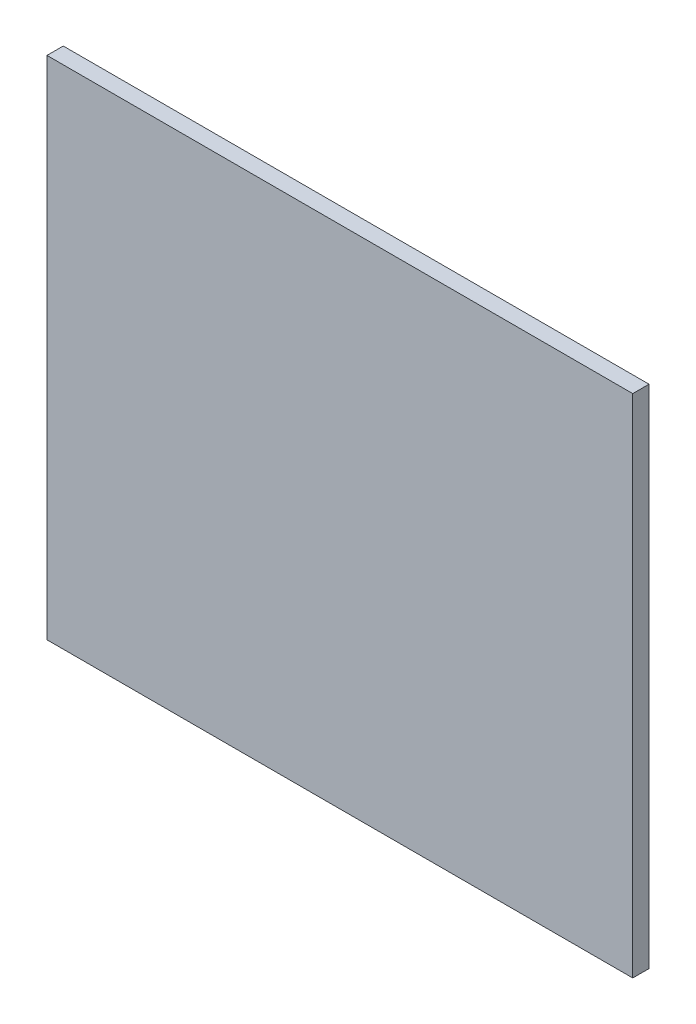
ISO-10303-21;
HEADER;
FILE_DESCRIPTION(('STEP AP214'),'2;1');
FILE_NAME('part.step','',(''),(''),'','','');
FILE_SCHEMA(('AUTOMOTIVE_DESIGN { 1 0 10303 214 1 1 1 1 }'));
ENDSEC;
DATA;
#1=APPLICATION_CONTEXT('core data for automotive mechanical design processes');
#2=APPLICATION_PROTOCOL_DEFINITION('international standard','automotive_design',2000,#1);
#3=PRODUCT_CONTEXT('',#1,'mechanical');
#4=PRODUCT('Part','Part','',(#3));
#5=PRODUCT_RELATED_PRODUCT_CATEGORY('part','',(#4));
#6=PRODUCT_DEFINITION_FORMATION('','',#4);
#7=PRODUCT_DEFINITION_CONTEXT('part definition',#1,'design');
#8=PRODUCT_DEFINITION('design','',#6,#7);
#9=PRODUCT_DEFINITION_SHAPE('','',#8);
#10=(LENGTH_UNIT() NAMED_UNIT(*) SI_UNIT(.MILLI.,.METRE.));
#11=(NAMED_UNIT(*) PLANE_ANGLE_UNIT() SI_UNIT($,.RADIAN.));
#12=(NAMED_UNIT(*) SI_UNIT($,.STERADIAN.) SOLID_ANGLE_UNIT());
#13=UNCERTAINTY_MEASURE_WITH_UNIT(LENGTH_MEASURE(1.E-05),#10,'distance_accuracy_value','');
#14=(GEOMETRIC_REPRESENTATION_CONTEXT(3) GLOBAL_UNCERTAINTY_ASSIGNED_CONTEXT((#13)) GLOBAL_UNIT_ASSIGNED_CONTEXT((#10,
#11,#12)) REPRESENTATION_CONTEXT('',''));
#15=CARTESIAN_POINT('',(0.,0.,0.));
#16=DIRECTION('',(0.,0.,1.));
#17=DIRECTION('',(1.,0.,0.));
#18=AXIS2_PLACEMENT_3D('',#15,#16,#17);
#19=CARTESIAN_POINT('',(0.,0.,2.));
#20=DIRECTION('',(1.,0.,0.));
#21=DIRECTION('',(0.,0.,-1.));
#22=AXIS2_PLACEMENT_3D('',#19,#20,#21);
#23=PLANE('',#22);
#24=DIRECTION('',(0.,-1.,0.));
#25=VECTOR('',#24,1.);
#26=CARTESIAN_POINT('',(0.,0.,0.));
#27=LINE('',#26,#25);
#28=CARTESIAN_POINT('',(0.,0.,0.));
#29=VERTEX_POINT('',#28);
#30=CARTESIAN_POINT('',(0.,-62.2102325177015,0.));
#31=VERTEX_POINT('',#30);
#32=EDGE_CURVE('E94',#29,#31,#27,.T.);
#33=ORIENTED_EDGE('',*,*,#32,.T.);
#34=DIRECTION('',(0.,0.,-1.));
#35=VECTOR('',#34,1.);
#36=CARTESIAN_POINT('',(0.,-62.2102325177015,2.));
#37=LINE('',#36,#35);
#38=CARTESIAN_POINT('',(0.,-62.2102325177015,2.));
#39=VERTEX_POINT('',#38);
#40=EDGE_CURVE('E11',#39,#31,#37,.T.);
#41=ORIENTED_EDGE('',*,*,#40,.F.);
#42=DIRECTION('',(0.,-1.,0.));
#43=VECTOR('',#42,1.);
#44=CARTESIAN_POINT('',(0.,0.,2.));
#45=LINE('',#44,#43);
#46=CARTESIAN_POINT('',(0.,0.,2.));
#47=VERTEX_POINT('',#46);
#48=EDGE_CURVE('E82',#47,#39,#45,.T.);
#49=ORIENTED_EDGE('',*,*,#48,.F.);
#50=DIRECTION('',(0.,0.,-1.));
#51=VECTOR('',#50,1.);
#52=CARTESIAN_POINT('',(0.,0.,2.));
#53=LINE('',#52,#51);
#54=EDGE_CURVE('E90',#47,#29,#53,.T.);
#55=ORIENTED_EDGE('',*,*,#54,.T.);
#56=EDGE_LOOP('',(#33,#41,#49,#55));
#57=FACE_BOUND('',#56,.T.);
#58=ADVANCED_FACE('F31',(#57),#23,.F.);
#59=CARTESIAN_POINT('',(0.,-62.2102325177015,2.));
#60=DIRECTION('',(0.,1.,0.));
#61=DIRECTION('',(0.,0.,1.));
#62=AXIS2_PLACEMENT_3D('',#59,#60,#61);
#63=PLANE('',#62);
#64=DIRECTION('',(1.,0.,0.));
#65=VECTOR('',#64,1.);
#66=CARTESIAN_POINT('',(0.,-62.2102325177015,0.));
#67=LINE('',#66,#65);
#68=CARTESIAN_POINT('',(71.9999312632,-62.2102325177015,0.));
#69=VERTEX_POINT('',#68);
#70=EDGE_CURVE('E86',#31,#69,#67,.T.);
#71=ORIENTED_EDGE('',*,*,#70,.T.);
#72=DIRECTION('',(0.,0.,-1.));
#73=VECTOR('',#72,1.);
#74=CARTESIAN_POINT('',(71.9999312632,-62.2102325177015,2.));
#75=LINE('',#74,#73);
#76=CARTESIAN_POINT('',(71.9999312632,-62.2102325177015,2.));
#77=VERTEX_POINT('',#76);
#78=EDGE_CURVE('E39',#77,#69,#75,.T.);
#79=ORIENTED_EDGE('',*,*,#78,.F.);
#80=DIRECTION('',(1.,0.,0.));
#81=VECTOR('',#80,1.);
#82=CARTESIAN_POINT('',(0.,-62.2102325177015,2.));
#83=LINE('',#82,#81);
#84=EDGE_CURVE('E77',#39,#77,#83,.T.);
#85=ORIENTED_EDGE('',*,*,#84,.F.);
#86=ORIENTED_EDGE('',*,*,#40,.T.);
#87=EDGE_LOOP('',(#71,#79,#85,#86));
#88=FACE_BOUND('',#87,.T.);
#89=ADVANCED_FACE('F85',(#88),#63,.F.);
#90=CARTESIAN_POINT('',(71.9999312632,0.,2.));
#91=DIRECTION('',(-1.,0.,0.));
#92=DIRECTION('',(0.,-1.,0.));
#93=AXIS2_PLACEMENT_3D('',#90,#91,#92);
#94=PLANE('',#93);
#95=DIRECTION('',(0.,1.,0.));
#96=VECTOR('',#95,1.);
#97=CARTESIAN_POINT('',(71.9999312632,0.,0.));
#98=LINE('',#97,#96);
#99=CARTESIAN_POINT('',(71.9999312632,0.,0.));
#100=VERTEX_POINT('',#99);
#101=EDGE_CURVE('E64',#69,#100,#98,.T.);
#102=ORIENTED_EDGE('',*,*,#101,.T.);
#103=DIRECTION('',(0.,0.,-1.));
#104=VECTOR('',#103,1.);
#105=CARTESIAN_POINT('',(71.9999312632,0.,2.));
#106=LINE('',#105,#104);
#107=CARTESIAN_POINT('',(71.9999312632,0.,2.));
#108=VERTEX_POINT('',#107);
#109=EDGE_CURVE('E87',#108,#100,#106,.T.);
#110=ORIENTED_EDGE('',*,*,#109,.F.);
#111=DIRECTION('',(0.,1.,0.));
#112=VECTOR('',#111,1.);
#113=CARTESIAN_POINT('',(71.9999312632,0.,2.));
#114=LINE('',#113,#112);
#115=EDGE_CURVE('E80',#77,#108,#114,.T.);
#116=ORIENTED_EDGE('',*,*,#115,.F.);
#117=ORIENTED_EDGE('',*,*,#78,.T.);
#118=EDGE_LOOP('',(#102,#110,#116,#117));
#119=FACE_BOUND('',#118,.T.);
#120=ADVANCED_FACE('F88',(#119),#94,.F.);
#121=CARTESIAN_POINT('',(0.,0.,2.));
#122=DIRECTION('',(0.,-1.,0.));
#123=DIRECTION('',(0.,0.,-1.));
#124=AXIS2_PLACEMENT_3D('',#121,#122,#123);
#125=PLANE('',#124);
#126=DIRECTION('',(-1.,0.,0.));
#127=VECTOR('',#126,1.);
#128=CARTESIAN_POINT('',(0.,0.,0.));
#129=LINE('',#128,#127);
#130=EDGE_CURVE('E70',#100,#29,#129,.T.);
#131=ORIENTED_EDGE('',*,*,#130,.T.);
#132=ORIENTED_EDGE('',*,*,#54,.F.);
#133=DIRECTION('',(-1.,0.,0.));
#134=VECTOR('',#133,1.);
#135=CARTESIAN_POINT('',(0.,0.,2.));
#136=LINE('',#135,#134);
#137=EDGE_CURVE('E47',#108,#47,#136,.T.);
#138=ORIENTED_EDGE('',*,*,#137,.F.);
#139=ORIENTED_EDGE('',*,*,#109,.T.);
#140=EDGE_LOOP('',(#131,#132,#138,#139));
#141=FACE_BOUND('',#140,.T.);
#142=ADVANCED_FACE('F101',(#141),#125,.F.);
#143=CARTESIAN_POINT('',(0.,-62.2102325177015,2.));
#144=DIRECTION('',(0.,0.,1.));
#145=DIRECTION('',(1.,0.,0.));
#146=AXIS2_PLACEMENT_3D('',#143,#144,#145);
#147=PLANE('',#146);
#148=ORIENTED_EDGE('',*,*,#48,.T.);
#149=ORIENTED_EDGE('',*,*,#84,.T.);
#150=ORIENTED_EDGE('',*,*,#115,.T.);
#151=ORIENTED_EDGE('',*,*,#137,.T.);
#152=EDGE_LOOP('',(#148,#149,#150,#151));
#153=FACE_BOUND('',#152,.T.);
#154=ADVANCED_FACE('F78',(#153),#147,.T.);
#155=CARTESIAN_POINT('',(0.,-62.2102325177015,0.));
#156=DIRECTION('',(0.,0.,1.));
#157=DIRECTION('',(1.,0.,0.));
#158=AXIS2_PLACEMENT_3D('',#155,#156,#157);
#159=PLANE('',#158);
#160=ORIENTED_EDGE('',*,*,#32,.F.);
#161=ORIENTED_EDGE('',*,*,#130,.F.);
#162=ORIENTED_EDGE('',*,*,#101,.F.);
#163=ORIENTED_EDGE('',*,*,#70,.F.);
#164=EDGE_LOOP('',(#160,#161,#162,#163));
#165=FACE_BOUND('',#164,.T.);
#166=ADVANCED_FACE('F104',(#165),#159,.F.);
#167=CLOSED_SHELL('',(#58,#89,#120,#142,#154,#166));
#168=MANIFOLD_SOLID_BREP('B2',#167);
#169=ADVANCED_BREP_SHAPE_REPRESENTATION('',(#18,#168),#14);
#170=SHAPE_DEFINITION_REPRESENTATION(#9,#169);
ENDSEC;
END-ISO-10303-21;
